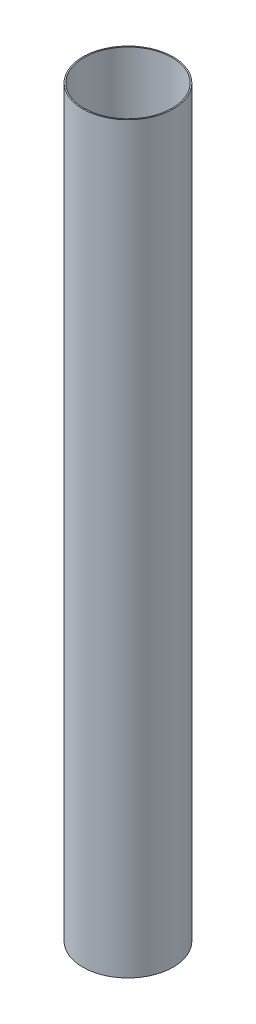
ISO-10303-21;
HEADER;
FILE_DESCRIPTION(('STEP AP214'),'2;1');
FILE_NAME('part.step','',(''),(''),'','','');
FILE_SCHEMA(('AUTOMOTIVE_DESIGN { 1 0 10303 214 1 1 1 1 }'));
ENDSEC;
DATA;
#1=APPLICATION_CONTEXT('core data for automotive mechanical design processes');
#2=APPLICATION_PROTOCOL_DEFINITION('international standard','automotive_design',2000,#1);
#3=PRODUCT_CONTEXT('',#1,'mechanical');
#4=PRODUCT('Part','Part','',(#3));
#5=PRODUCT_RELATED_PRODUCT_CATEGORY('part','',(#4));
#6=PRODUCT_DEFINITION_FORMATION('','',#4);
#7=PRODUCT_DEFINITION_CONTEXT('part definition',#1,'design');
#8=PRODUCT_DEFINITION('design','',#6,#7);
#9=PRODUCT_DEFINITION_SHAPE('','',#8);
#10=(LENGTH_UNIT() NAMED_UNIT(*) SI_UNIT(.MILLI.,.METRE.));
#11=(NAMED_UNIT(*) PLANE_ANGLE_UNIT() SI_UNIT($,.RADIAN.));
#12=(NAMED_UNIT(*) SI_UNIT($,.STERADIAN.) SOLID_ANGLE_UNIT());
#13=UNCERTAINTY_MEASURE_WITH_UNIT(LENGTH_MEASURE(1.E-05),#10,'distance_accuracy_value','');
#14=(GEOMETRIC_REPRESENTATION_CONTEXT(3) GLOBAL_UNCERTAINTY_ASSIGNED_CONTEXT((#13)) GLOBAL_UNIT_ASSIGNED_CONTEXT((#10,
#11,#12)) REPRESENTATION_CONTEXT('',''));
#15=CARTESIAN_POINT('',(0.,0.,0.));
#16=DIRECTION('',(0.,0.,1.));
#17=DIRECTION('',(1.,0.,0.));
#18=AXIS2_PLACEMENT_3D('',#15,#16,#17);
#19=CARTESIAN_POINT('',(0.,1250.,0.));
#20=DIRECTION('',(0.,1.,0.));
#21=DIRECTION('',(0.,0.,1.));
#22=AXIS2_PLACEMENT_3D('',#19,#20,#21);
#23=PLANE('',#22);
#24=CARTESIAN_POINT('',(0.,1250.,0.));
#25=DIRECTION('',(0.,1.,0.));
#26=DIRECTION('',(0.,0.,1.));
#27=AXIS2_PLACEMENT_3D('',#24,#25,#26);
#28=CIRCLE('',#27,76.);
#29=CARTESIAN_POINT('',(0.,1250.,76.));
#30=VERTEX_POINT('',#29);
#31=EDGE_CURVE('E10',#30,#30,#28,.T.);
#32=ORIENTED_EDGE('',*,*,#31,.T.);
#33=EDGE_LOOP('',(#32));
#34=FACE_BOUND('',#33,.T.);
#35=CARTESIAN_POINT('',(0.,1250.,0.));
#36=DIRECTION('',(0.,1.,0.));
#37=DIRECTION('',(0.,0.,1.));
#38=AXIS2_PLACEMENT_3D('',#35,#36,#37);
#39=CIRCLE('',#38,74.);
#40=CARTESIAN_POINT('',(0.,1250.,74.));
#41=VERTEX_POINT('',#40);
#42=EDGE_CURVE('E44',#41,#41,#39,.T.);
#43=ORIENTED_EDGE('',*,*,#42,.F.);
#44=EDGE_LOOP('',(#43));
#45=FACE_BOUND('',#44,.T.);
#46=ADVANCED_FACE('F33',(#34,#45),#23,.T.);
#47=CARTESIAN_POINT('',(0.,0.,0.));
#48=DIRECTION('',(0.,1.,0.));
#49=DIRECTION('',(0.,0.,1.));
#50=AXIS2_PLACEMENT_3D('',#47,#48,#49);
#51=PLANE('',#50);
#52=CARTESIAN_POINT('',(0.,0.,0.));
#53=DIRECTION('',(0.,1.,0.));
#54=DIRECTION('',(0.,0.,1.));
#55=AXIS2_PLACEMENT_3D('',#52,#53,#54);
#56=CIRCLE('',#55,76.);
#57=CARTESIAN_POINT('',(0.,0.,76.));
#58=VERTEX_POINT('',#57);
#59=EDGE_CURVE('E37',#58,#58,#56,.T.);
#60=ORIENTED_EDGE('',*,*,#59,.F.);
#61=EDGE_LOOP('',(#60));
#62=FACE_BOUND('',#61,.T.);
#63=CARTESIAN_POINT('',(0.,0.,0.));
#64=DIRECTION('',(0.,1.,0.));
#65=DIRECTION('',(0.,0.,1.));
#66=AXIS2_PLACEMENT_3D('',#63,#64,#65);
#67=CIRCLE('',#66,74.);
#68=CARTESIAN_POINT('',(0.,0.,74.));
#69=VERTEX_POINT('',#68);
#70=EDGE_CURVE('E46',#69,#69,#67,.T.);
#71=ORIENTED_EDGE('',*,*,#70,.T.);
#72=EDGE_LOOP('',(#71));
#73=FACE_BOUND('',#72,.T.);
#74=ADVANCED_FACE('F56',(#62,#73),#51,.F.);
#75=CARTESIAN_POINT('',(0.,1250.,0.));
#76=DIRECTION('',(0.,-1.,0.));
#77=DIRECTION('',(0.,0.,-1.));
#78=AXIS2_PLACEMENT_3D('',#75,#76,#77);
#79=CYLINDRICAL_SURFACE('',#78,76.);
#80=ORIENTED_EDGE('',*,*,#31,.F.);
#81=EDGE_LOOP('',(#80));
#82=FACE_BOUND('',#81,.T.);
#83=ORIENTED_EDGE('',*,*,#59,.T.);
#84=EDGE_LOOP('',(#83));
#85=FACE_BOUND('',#84,.T.);
#86=ADVANCED_FACE('F35',(#82,#85),#79,.T.);
#87=CARTESIAN_POINT('',(0.,1250.,0.));
#88=DIRECTION('',(0.,-1.,0.));
#89=DIRECTION('',(0.,0.,-1.));
#90=AXIS2_PLACEMENT_3D('',#87,#88,#89);
#91=CYLINDRICAL_SURFACE('',#90,74.);
#92=ORIENTED_EDGE('',*,*,#42,.T.);
#93=EDGE_LOOP('',(#92));
#94=FACE_BOUND('',#93,.T.);
#95=ORIENTED_EDGE('',*,*,#70,.F.);
#96=EDGE_LOOP('',(#95));
#97=FACE_BOUND('',#96,.T.);
#98=ADVANCED_FACE('F52',(#94,#97),#91,.F.);
#99=CLOSED_SHELL('',(#46,#74,#86,#98));
#100=MANIFOLD_SOLID_BREP('B2',#99);
#101=ADVANCED_BREP_SHAPE_REPRESENTATION('',(#18,#100),#14);
#102=SHAPE_DEFINITION_REPRESENTATION(#9,#101);
ENDSEC;
END-ISO-10303-21;
